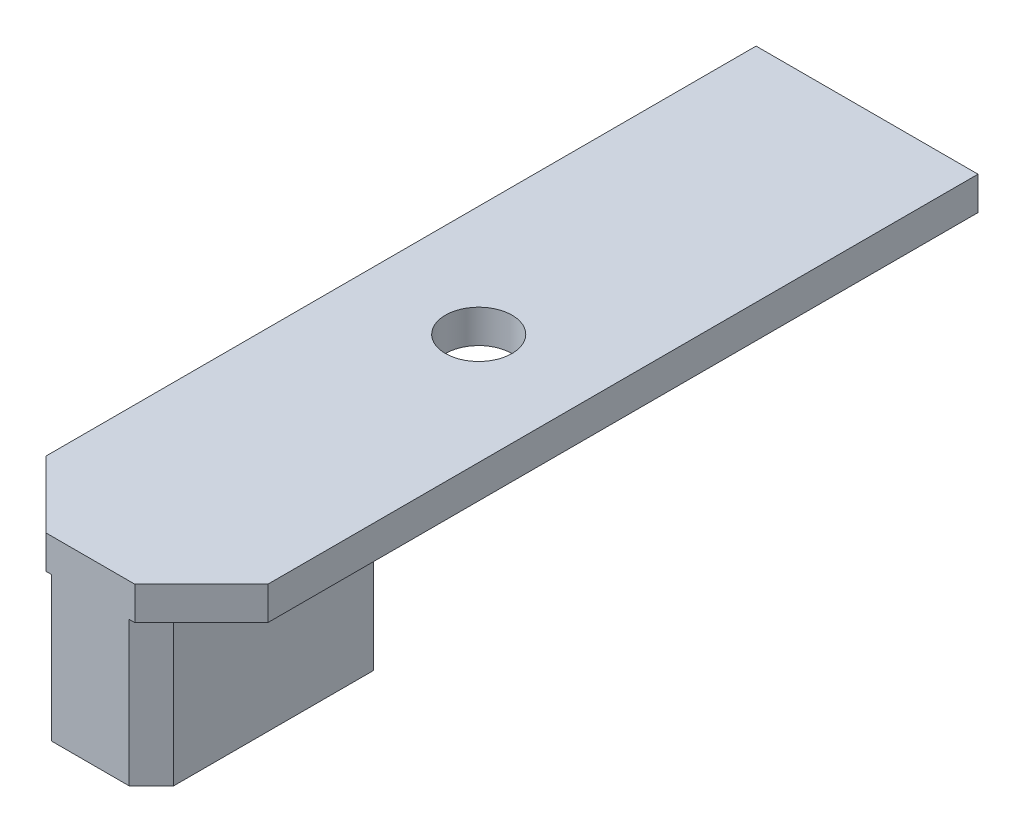
ISO-10303-21;
HEADER;
FILE_DESCRIPTION(('STEP AP214'),'2;1');
FILE_NAME('part.step','',(''),(''),'','','');
FILE_SCHEMA(('AUTOMOTIVE_DESIGN { 1 0 10303 214 1 1 1 1 }'));
ENDSEC;
DATA;
#1=APPLICATION_CONTEXT('core data for automotive mechanical design processes');
#2=APPLICATION_PROTOCOL_DEFINITION('international standard','automotive_design',2000,#1);
#3=PRODUCT_CONTEXT('',#1,'mechanical');
#4=PRODUCT('Part','Part','',(#3));
#5=PRODUCT_RELATED_PRODUCT_CATEGORY('part','',(#4));
#6=PRODUCT_DEFINITION_FORMATION('','',#4);
#7=PRODUCT_DEFINITION_CONTEXT('part definition',#1,'design');
#8=PRODUCT_DEFINITION('design','',#6,#7);
#9=PRODUCT_DEFINITION_SHAPE('','',#8);
#10=(LENGTH_UNIT() NAMED_UNIT(*) SI_UNIT(.MILLI.,.METRE.));
#11=(NAMED_UNIT(*) PLANE_ANGLE_UNIT() SI_UNIT($,.RADIAN.));
#12=(NAMED_UNIT(*) SI_UNIT($,.STERADIAN.) SOLID_ANGLE_UNIT());
#13=UNCERTAINTY_MEASURE_WITH_UNIT(LENGTH_MEASURE(1.E-05),#10,'distance_accuracy_value','');
#14=(GEOMETRIC_REPRESENTATION_CONTEXT(3) GLOBAL_UNCERTAINTY_ASSIGNED_CONTEXT((#13)) GLOBAL_UNIT_ASSIGNED_CONTEXT((#10,
#11,#12)) REPRESENTATION_CONTEXT('',''));
#15=CARTESIAN_POINT('',(0.,0.,0.));
#16=DIRECTION('',(0.,0.,1.));
#17=DIRECTION('',(1.,0.,0.));
#18=AXIS2_PLACEMENT_3D('',#15,#16,#17);
#19=CARTESIAN_POINT('',(0.,0.,0.));
#20=DIRECTION('',(0.,1.,0.));
#21=DIRECTION('',(0.,0.,1.));
#22=AXIS2_PLACEMENT_3D('',#19,#20,#21);
#23=PLANE('',#22);
#24=CARTESIAN_POINT('',(-5.,0.,-17.5));
#25=DIRECTION('',(0.,1.,0.));
#26=DIRECTION('',(0.,0.,1.));
#27=AXIS2_PLACEMENT_3D('',#24,#25,#26);
#28=CIRCLE('',#27,1.5);
#29=CARTESIAN_POINT('',(-5.,0.,-16.));
#30=VERTEX_POINT('',#29);
#31=EDGE_CURVE('E388',#30,#30,#28,.T.);
#32=ORIENTED_EDGE('',*,*,#31,.T.);
#33=EDGE_LOOP('',(#32));
#34=FACE_BOUND('',#33,.T.);
#35=DIRECTION('',(-0.707106781186548,0.,-0.707106781186548));
#36=VECTOR('',#35,1.);
#37=CARTESIAN_POINT('',(-6.75,0.,0.));
#38=LINE('',#37,#36);
#39=CARTESIAN_POINT('',(-6.75,0.,0.));
#40=VERTEX_POINT('',#39);
#41=CARTESIAN_POINT('',(-7.75,0.,-1.));
#42=VERTEX_POINT('',#41);
#43=EDGE_CURVE('E143',#40,#42,#38,.T.);
#44=ORIENTED_EDGE('',*,*,#43,.F.);
#45=DIRECTION('',(1.,0.,0.));
#46=VECTOR('',#45,1.);
#47=CARTESIAN_POINT('',(-3.,0.,0.));
#48=LINE('',#47,#46);
#49=CARTESIAN_POINT('',(-7.,0.,0.));
#50=VERTEX_POINT('',#49);
#51=EDGE_CURVE('E180',#50,#40,#48,.T.);
#52=ORIENTED_EDGE('',*,*,#51,.F.);
#53=DIRECTION('',(0.707106781186548,0.,0.707106781186547));
#54=VECTOR('',#53,1.);
#55=CARTESIAN_POINT('',(-7.,0.,0.));
#56=LINE('',#55,#54);
#57=CARTESIAN_POINT('',(-10.,0.,-3.));
#58=VERTEX_POINT('',#57);
#59=EDGE_CURVE('E149',#58,#50,#56,.T.);
#60=ORIENTED_EDGE('',*,*,#59,.F.);
#61=DIRECTION('',(0.,0.,1.));
#62=VECTOR('',#61,1.);
#63=CARTESIAN_POINT('',(-10.,0.,-3.));
#64=LINE('',#63,#62);
#65=CARTESIAN_POINT('',(-10.,0.,-35.));
#66=VERTEX_POINT('',#65);
#67=EDGE_CURVE('E146',#66,#58,#64,.T.);
#68=ORIENTED_EDGE('',*,*,#67,.F.);
#69=DIRECTION('',(-1.,0.,0.));
#70=VECTOR('',#69,1.);
#71=CARTESIAN_POINT('',(0.,0.,-35.));
#72=LINE('',#71,#70);
#73=CARTESIAN_POINT('',(0.,0.,-35.));
#74=VERTEX_POINT('',#73);
#75=EDGE_CURVE('E159',#74,#66,#72,.T.);
#76=ORIENTED_EDGE('',*,*,#75,.F.);
#77=DIRECTION('',(0.,0.,-1.));
#78=VECTOR('',#77,1.);
#79=CARTESIAN_POINT('',(0.,0.,-3.));
#80=LINE('',#79,#78);
#81=CARTESIAN_POINT('',(0.,0.,-3.));
#82=VERTEX_POINT('',#81);
#83=EDGE_CURVE('E196',#82,#74,#80,.T.);
#84=ORIENTED_EDGE('',*,*,#83,.F.);
#85=DIRECTION('',(0.707106781186547,0.,-0.707106781186548));
#86=VECTOR('',#85,1.);
#87=CARTESIAN_POINT('',(0.,0.,-3.));
#88=LINE('',#87,#86);
#89=CARTESIAN_POINT('',(-3.,0.,0.));
#90=VERTEX_POINT('',#89);
#91=EDGE_CURVE('E174',#90,#82,#88,.T.);
#92=ORIENTED_EDGE('',*,*,#91,.F.);
#93=CARTESIAN_POINT('',(-3.25,0.,0.));
#94=VERTEX_POINT('',#93);
#95=EDGE_CURVE('E171',#94,#90,#48,.T.);
#96=ORIENTED_EDGE('',*,*,#95,.F.);
#97=DIRECTION('',(-0.707106781186548,0.,0.707106781186548));
#98=VECTOR('',#97,1.);
#99=CARTESIAN_POINT('',(-2.25,0.,-0.999999999999999));
#100=LINE('',#99,#98);
#101=CARTESIAN_POINT('',(-2.25,0.,-0.999999999999999));
#102=VERTEX_POINT('',#101);
#103=EDGE_CURVE('E57',#102,#94,#100,.T.);
#104=ORIENTED_EDGE('',*,*,#103,.F.);
#105=DIRECTION('',(0.,0.,1.));
#106=VECTOR('',#105,1.);
#107=CARTESIAN_POINT('',(-2.25,0.,-0.999999999999999));
#108=LINE('',#107,#106);
#109=CARTESIAN_POINT('',(-2.25,0.,-10.));
#110=VERTEX_POINT('',#109);
#111=EDGE_CURVE('E232',#110,#102,#108,.T.);
#112=ORIENTED_EDGE('',*,*,#111,.F.);
#113=DIRECTION('',(1.,0.,0.));
#114=VECTOR('',#113,1.);
#115=CARTESIAN_POINT('',(-2.25,0.,-10.));
#116=LINE('',#115,#114);
#117=CARTESIAN_POINT('',(-7.75,0.,-10.));
#118=VERTEX_POINT('',#117);
#119=EDGE_CURVE('E234',#118,#110,#116,.T.);
#120=ORIENTED_EDGE('',*,*,#119,.F.);
#121=DIRECTION('',(0.,0.,-1.));
#122=VECTOR('',#121,1.);
#123=CARTESIAN_POINT('',(-7.75,0.,-1.));
#124=LINE('',#123,#122);
#125=EDGE_CURVE('E50',#42,#118,#124,.T.);
#126=ORIENTED_EDGE('',*,*,#125,.F.);
#127=EDGE_LOOP('',(#44,#52,#60,#68,#76,#84,#92,#96,#104,#112,#120,#126));
#128=FACE_BOUND('',#127,.T.);
#129=ADVANCED_FACE('F33',(#34,#128),#23,.F.);
#130=CARTESIAN_POINT('',(-10.,1.5,-3.));
#131=DIRECTION('',(1.,0.,0.));
#132=DIRECTION('',(0.,0.,-1.));
#133=AXIS2_PLACEMENT_3D('',#130,#131,#132);
#134=PLANE('',#133);
#135=ORIENTED_EDGE('',*,*,#67,.T.);
#136=DIRECTION('',(0.,-1.,0.));
#137=VECTOR('',#136,1.);
#138=CARTESIAN_POINT('',(-10.,1.5,-3.));
#139=LINE('',#138,#137);
#140=CARTESIAN_POINT('',(-10.,1.5,-3.));
#141=VERTEX_POINT('',#140);
#142=EDGE_CURVE('E11',#141,#58,#139,.T.);
#143=ORIENTED_EDGE('',*,*,#142,.F.);
#144=DIRECTION('',(0.,0.,1.));
#145=VECTOR('',#144,1.);
#146=CARTESIAN_POINT('',(-10.,1.5,-3.));
#147=LINE('',#146,#145);
#148=CARTESIAN_POINT('',(-10.,1.5,-35.));
#149=VERTEX_POINT('',#148);
#150=EDGE_CURVE('E155',#149,#141,#147,.T.);
#151=ORIENTED_EDGE('',*,*,#150,.F.);
#152=DIRECTION('',(0.,-1.,0.));
#153=VECTOR('',#152,1.);
#154=CARTESIAN_POINT('',(-10.,1.5,-35.));
#155=LINE('',#154,#153);
#156=EDGE_CURVE('E168',#149,#66,#155,.T.);
#157=ORIENTED_EDGE('',*,*,#156,.T.);
#158=EDGE_LOOP('',(#135,#143,#151,#157));
#159=FACE_BOUND('',#158,.T.);
#160=ADVANCED_FACE('F35',(#159),#134,.F.);
#161=CARTESIAN_POINT('',(-7.,1.5,0.));
#162=DIRECTION('',(0.707106781186547,0.,-0.707106781186548));
#163=DIRECTION('',(-0.707106781186548,0.,-0.707106781186547));
#164=AXIS2_PLACEMENT_3D('',#161,#162,#163);
#165=PLANE('',#164);
#166=ORIENTED_EDGE('',*,*,#59,.T.);
#167=DIRECTION('',(0.,-1.,0.));
#168=VECTOR('',#167,1.);
#169=CARTESIAN_POINT('',(-7.,1.5,0.));
#170=LINE('',#169,#168);
#171=CARTESIAN_POINT('',(-7.,1.5,0.));
#172=VERTEX_POINT('',#171);
#173=EDGE_CURVE('E42',#172,#50,#170,.T.);
#174=ORIENTED_EDGE('',*,*,#173,.F.);
#175=DIRECTION('',(0.707106781186548,0.,0.707106781186547));
#176=VECTOR('',#175,1.);
#177=CARTESIAN_POINT('',(-7.,1.5,0.));
#178=LINE('',#177,#176);
#179=EDGE_CURVE('E158',#141,#172,#178,.T.);
#180=ORIENTED_EDGE('',*,*,#179,.F.);
#181=ORIENTED_EDGE('',*,*,#142,.T.);
#182=EDGE_LOOP('',(#166,#174,#180,#181));
#183=FACE_BOUND('',#182,.T.);
#184=ADVANCED_FACE('F254',(#183),#165,.F.);
#185=CARTESIAN_POINT('',(-3.,1.5,0.));
#186=DIRECTION('',(0.,0.,-1.));
#187=DIRECTION('',(-1.,0.,0.));
#188=AXIS2_PLACEMENT_3D('',#185,#186,#187);
#189=PLANE('',#188);
#190=ORIENTED_EDGE('',*,*,#51,.T.);
#191=DIRECTION('',(0.,1.,0.));
#192=VECTOR('',#191,1.);
#193=CARTESIAN_POINT('',(-6.75,-6.5,0.));
#194=LINE('',#193,#192);
#195=CARTESIAN_POINT('',(-6.75,-6.5,0.));
#196=VERTEX_POINT('',#195);
#197=EDGE_CURVE('E244',#196,#40,#194,.T.);
#198=ORIENTED_EDGE('',*,*,#197,.F.);
#199=DIRECTION('',(-1.,0.,0.));
#200=VECTOR('',#199,1.);
#201=CARTESIAN_POINT('',(-3.25,-6.5,0.));
#202=LINE('',#201,#200);
#203=CARTESIAN_POINT('',(-3.25,-6.5,0.));
#204=VERTEX_POINT('',#203);
#205=EDGE_CURVE('E251',#204,#196,#202,.T.);
#206=ORIENTED_EDGE('',*,*,#205,.F.);
#207=DIRECTION('',(0.,1.,0.));
#208=VECTOR('',#207,1.);
#209=CARTESIAN_POINT('',(-3.25,-6.5,0.));
#210=LINE('',#209,#208);
#211=EDGE_CURVE('E226',#204,#94,#210,.T.);
#212=ORIENTED_EDGE('',*,*,#211,.T.);
#213=ORIENTED_EDGE('',*,*,#95,.T.);
#214=DIRECTION('',(0.,-1.,0.));
#215=VECTOR('',#214,1.);
#216=CARTESIAN_POINT('',(-3.,1.5,0.));
#217=LINE('',#216,#215);
#218=CARTESIAN_POINT('',(-3.,1.5,0.));
#219=VERTEX_POINT('',#218);
#220=EDGE_CURVE('E185',#219,#90,#217,.T.);
#221=ORIENTED_EDGE('',*,*,#220,.F.);
#222=DIRECTION('',(1.,0.,0.));
#223=VECTOR('',#222,1.);
#224=CARTESIAN_POINT('',(-3.,1.5,0.));
#225=LINE('',#224,#223);
#226=EDGE_CURVE('E161',#172,#219,#225,.T.);
#227=ORIENTED_EDGE('',*,*,#226,.F.);
#228=ORIENTED_EDGE('',*,*,#173,.T.);
#229=EDGE_LOOP('',(#190,#198,#206,#212,#213,#221,#227,#228));
#230=FACE_BOUND('',#229,.T.);
#231=ADVANCED_FACE('F222',(#230),#189,.F.);
#232=CARTESIAN_POINT('',(0.,1.5,-3.));
#233=DIRECTION('',(-0.707106781186548,0.,-0.707106781186547));
#234=DIRECTION('',(-0.707106781186547,0.,0.707106781186548));
#235=AXIS2_PLACEMENT_3D('',#232,#233,#234);
#236=PLANE('',#235);
#237=ORIENTED_EDGE('',*,*,#91,.T.);
#238=DIRECTION('',(0.,-1.,0.));
#239=VECTOR('',#238,1.);
#240=CARTESIAN_POINT('',(0.,1.5,-3.));
#241=LINE('',#240,#239);
#242=CARTESIAN_POINT('',(0.,1.5,-3.));
#243=VERTEX_POINT('',#242);
#244=EDGE_CURVE('E188',#243,#82,#241,.T.);
#245=ORIENTED_EDGE('',*,*,#244,.F.);
#246=DIRECTION('',(0.707106781186547,0.,-0.707106781186548));
#247=VECTOR('',#246,1.);
#248=CARTESIAN_POINT('',(0.,1.5,-3.));
#249=LINE('',#248,#247);
#250=EDGE_CURVE('E163',#219,#243,#249,.T.);
#251=ORIENTED_EDGE('',*,*,#250,.F.);
#252=ORIENTED_EDGE('',*,*,#220,.T.);
#253=EDGE_LOOP('',(#237,#245,#251,#252));
#254=FACE_BOUND('',#253,.T.);
#255=ADVANCED_FACE('F203',(#254),#236,.F.);
#256=CARTESIAN_POINT('',(0.,1.5,-3.));
#257=DIRECTION('',(-1.,0.,0.));
#258=DIRECTION('',(0.,0.,1.));
#259=AXIS2_PLACEMENT_3D('',#256,#257,#258);
#260=PLANE('',#259);
#261=ORIENTED_EDGE('',*,*,#83,.T.);
#262=DIRECTION('',(0.,-1.,0.));
#263=VECTOR('',#262,1.);
#264=CARTESIAN_POINT('',(0.,1.5,-35.));
#265=LINE('',#264,#263);
#266=CARTESIAN_POINT('',(0.,1.5,-35.));
#267=VERTEX_POINT('',#266);
#268=EDGE_CURVE('E191',#267,#74,#265,.T.);
#269=ORIENTED_EDGE('',*,*,#268,.F.);
#270=DIRECTION('',(0.,0.,-1.));
#271=VECTOR('',#270,1.);
#272=CARTESIAN_POINT('',(0.,1.5,-3.));
#273=LINE('',#272,#271);
#274=EDGE_CURVE('E165',#243,#267,#273,.T.);
#275=ORIENTED_EDGE('',*,*,#274,.F.);
#276=ORIENTED_EDGE('',*,*,#244,.T.);
#277=EDGE_LOOP('',(#261,#269,#275,#276));
#278=FACE_BOUND('',#277,.T.);
#279=ADVANCED_FACE('F207',(#278),#260,.F.);
#280=CARTESIAN_POINT('',(0.,1.5,-35.));
#281=DIRECTION('',(0.,0.,1.));
#282=DIRECTION('',(1.,0.,0.));
#283=AXIS2_PLACEMENT_3D('',#280,#281,#282);
#284=PLANE('',#283);
#285=ORIENTED_EDGE('',*,*,#75,.T.);
#286=ORIENTED_EDGE('',*,*,#156,.F.);
#287=DIRECTION('',(-1.,0.,0.));
#288=VECTOR('',#287,1.);
#289=CARTESIAN_POINT('',(0.,1.5,-35.));
#290=LINE('',#289,#288);
#291=EDGE_CURVE('E167',#267,#149,#290,.T.);
#292=ORIENTED_EDGE('',*,*,#291,.F.);
#293=ORIENTED_EDGE('',*,*,#268,.T.);
#294=EDGE_LOOP('',(#285,#286,#292,#293));
#295=FACE_BOUND('',#294,.T.);
#296=ADVANCED_FACE('F212',(#295),#284,.F.);
#297=CARTESIAN_POINT('',(0.,1.5,0.));
#298=DIRECTION('',(0.,1.,0.));
#299=DIRECTION('',(0.,0.,1.));
#300=AXIS2_PLACEMENT_3D('',#297,#298,#299);
#301=PLANE('',#300);
#302=CARTESIAN_POINT('',(-5.,1.5,-17.5));
#303=DIRECTION('',(0.,1.,0.));
#304=DIRECTION('',(0.,0.,1.));
#305=AXIS2_PLACEMENT_3D('',#302,#303,#304);
#306=CIRCLE('',#305,1.5);
#307=CARTESIAN_POINT('',(-5.,1.5,-16.));
#308=VERTEX_POINT('',#307);
#309=EDGE_CURVE('E386',#308,#308,#306,.T.);
#310=ORIENTED_EDGE('',*,*,#309,.F.);
#311=EDGE_LOOP('',(#310));
#312=FACE_BOUND('',#311,.T.);
#313=ORIENTED_EDGE('',*,*,#150,.T.);
#314=ORIENTED_EDGE('',*,*,#179,.T.);
#315=ORIENTED_EDGE('',*,*,#226,.T.);
#316=ORIENTED_EDGE('',*,*,#250,.T.);
#317=ORIENTED_EDGE('',*,*,#274,.T.);
#318=ORIENTED_EDGE('',*,*,#291,.T.);
#319=EDGE_LOOP('',(#313,#314,#315,#316,#317,#318));
#320=FACE_BOUND('',#319,.T.);
#321=ADVANCED_FACE('F218',(#312,#320),#301,.T.);
#322=CARTESIAN_POINT('',(-7.75,-6.5,-1.));
#323=DIRECTION('',(1.,0.,0.));
#324=DIRECTION('',(0.,0.,-1.));
#325=AXIS2_PLACEMENT_3D('',#322,#323,#324);
#326=PLANE('',#325);
#327=ORIENTED_EDGE('',*,*,#125,.T.);
#328=DIRECTION('',(0.,1.,0.));
#329=VECTOR('',#328,1.);
#330=CARTESIAN_POINT('',(-7.75,-6.5,-10.));
#331=LINE('',#330,#329);
#332=CARTESIAN_POINT('',(-7.75,-6.5,-10.));
#333=VERTEX_POINT('',#332);
#334=EDGE_CURVE('E128',#333,#118,#331,.T.);
#335=ORIENTED_EDGE('',*,*,#334,.F.);
#336=DIRECTION('',(0.,0.,-1.));
#337=VECTOR('',#336,1.);
#338=CARTESIAN_POINT('',(-7.75,-6.5,-1.));
#339=LINE('',#338,#337);
#340=CARTESIAN_POINT('',(-7.75,-6.5,-1.));
#341=VERTEX_POINT('',#340);
#342=EDGE_CURVE('E134',#341,#333,#339,.T.);
#343=ORIENTED_EDGE('',*,*,#342,.F.);
#344=DIRECTION('',(0.,1.,0.));
#345=VECTOR('',#344,1.);
#346=CARTESIAN_POINT('',(-7.75,-6.5,-1.));
#347=LINE('',#346,#345);
#348=EDGE_CURVE('E243',#341,#42,#347,.T.);
#349=ORIENTED_EDGE('',*,*,#348,.T.);
#350=EDGE_LOOP('',(#327,#335,#343,#349));
#351=FACE_BOUND('',#350,.T.);
#352=ADVANCED_FACE('F145',(#351),#326,.F.);
#353=CARTESIAN_POINT('',(-2.25,-6.5,-10.));
#354=DIRECTION('',(0.,0.,1.));
#355=DIRECTION('',(1.,0.,0.));
#356=AXIS2_PLACEMENT_3D('',#353,#354,#355);
#357=PLANE('',#356);
#358=ORIENTED_EDGE('',*,*,#119,.T.);
#359=DIRECTION('',(0.,1.,0.));
#360=VECTOR('',#359,1.);
#361=CARTESIAN_POINT('',(-2.25,-6.5,-10.));
#362=LINE('',#361,#360);
#363=CARTESIAN_POINT('',(-2.25,-6.5,-10.));
#364=VERTEX_POINT('',#363);
#365=EDGE_CURVE('E130',#364,#110,#362,.T.);
#366=ORIENTED_EDGE('',*,*,#365,.F.);
#367=DIRECTION('',(1.,0.,0.));
#368=VECTOR('',#367,1.);
#369=CARTESIAN_POINT('',(-2.25,-6.5,-10.));
#370=LINE('',#369,#368);
#371=EDGE_CURVE('E123',#333,#364,#370,.T.);
#372=ORIENTED_EDGE('',*,*,#371,.F.);
#373=ORIENTED_EDGE('',*,*,#334,.T.);
#374=EDGE_LOOP('',(#358,#366,#372,#373));
#375=FACE_BOUND('',#374,.T.);
#376=ADVANCED_FACE('F126',(#375),#357,.F.);
#377=CARTESIAN_POINT('',(-2.25,-6.5,-0.999999999999999));
#378=DIRECTION('',(-1.,0.,0.));
#379=DIRECTION('',(0.,0.,1.));
#380=AXIS2_PLACEMENT_3D('',#377,#378,#379);
#381=PLANE('',#380);
#382=ORIENTED_EDGE('',*,*,#111,.T.);
#383=DIRECTION('',(0.,1.,0.));
#384=VECTOR('',#383,1.);
#385=CARTESIAN_POINT('',(-2.25,-6.5,-0.999999999999999));
#386=LINE('',#385,#384);
#387=CARTESIAN_POINT('',(-2.25,-6.5,-0.999999999999999));
#388=VERTEX_POINT('',#387);
#389=EDGE_CURVE('E151',#388,#102,#386,.T.);
#390=ORIENTED_EDGE('',*,*,#389,.F.);
#391=DIRECTION('',(0.,0.,1.));
#392=VECTOR('',#391,1.);
#393=CARTESIAN_POINT('',(-2.25,-6.5,-0.999999999999999));
#394=LINE('',#393,#392);
#395=EDGE_CURVE('E133',#364,#388,#394,.T.);
#396=ORIENTED_EDGE('',*,*,#395,.F.);
#397=ORIENTED_EDGE('',*,*,#365,.T.);
#398=EDGE_LOOP('',(#382,#390,#396,#397));
#399=FACE_BOUND('',#398,.T.);
#400=ADVANCED_FACE('F309',(#399),#381,.F.);
#401=CARTESIAN_POINT('',(-2.25,-6.5,-0.999999999999999));
#402=DIRECTION('',(-0.707106781186548,0.,-0.707106781186548));
#403=DIRECTION('',(-0.707106781186548,0.,0.707106781186547));
#404=AXIS2_PLACEMENT_3D('',#401,#402,#403);
#405=PLANE('',#404);
#406=ORIENTED_EDGE('',*,*,#103,.T.);
#407=ORIENTED_EDGE('',*,*,#211,.F.);
#408=DIRECTION('',(-0.707106781186548,0.,0.707106781186548));
#409=VECTOR('',#408,1.);
#410=CARTESIAN_POINT('',(-2.25,-6.5,-0.999999999999999));
#411=LINE('',#410,#409);
#412=EDGE_CURVE('E394',#388,#204,#411,.T.);
#413=ORIENTED_EDGE('',*,*,#412,.F.);
#414=ORIENTED_EDGE('',*,*,#389,.T.);
#415=EDGE_LOOP('',(#406,#407,#413,#414));
#416=FACE_BOUND('',#415,.T.);
#417=ADVANCED_FACE('F229',(#416),#405,.F.);
#418=CARTESIAN_POINT('',(-6.75,-6.5,0.));
#419=DIRECTION('',(0.707106781186548,0.,-0.707106781186548));
#420=DIRECTION('',(-0.707106781186548,0.,-0.707106781186548));
#421=AXIS2_PLACEMENT_3D('',#418,#419,#420);
#422=PLANE('',#421);
#423=ORIENTED_EDGE('',*,*,#43,.T.);
#424=ORIENTED_EDGE('',*,*,#348,.F.);
#425=DIRECTION('',(-0.707106781186548,0.,-0.707106781186548));
#426=VECTOR('',#425,1.);
#427=CARTESIAN_POINT('',(-6.75,-6.5,0.));
#428=LINE('',#427,#426);
#429=EDGE_CURVE('E139',#196,#341,#428,.T.);
#430=ORIENTED_EDGE('',*,*,#429,.F.);
#431=ORIENTED_EDGE('',*,*,#197,.T.);
#432=EDGE_LOOP('',(#423,#424,#430,#431));
#433=FACE_BOUND('',#432,.T.);
#434=ADVANCED_FACE('F250',(#433),#422,.F.);
#435=CARTESIAN_POINT('',(0.,-6.5,0.));
#436=DIRECTION('',(0.,1.,0.));
#437=DIRECTION('',(0.,0.,1.));
#438=AXIS2_PLACEMENT_3D('',#435,#436,#437);
#439=PLANE('',#438);
#440=ORIENTED_EDGE('',*,*,#342,.T.);
#441=ORIENTED_EDGE('',*,*,#371,.T.);
#442=ORIENTED_EDGE('',*,*,#395,.T.);
#443=ORIENTED_EDGE('',*,*,#412,.T.);
#444=ORIENTED_EDGE('',*,*,#205,.T.);
#445=ORIENTED_EDGE('',*,*,#429,.T.);
#446=EDGE_LOOP('',(#440,#441,#442,#443,#444,#445));
#447=FACE_BOUND('',#446,.T.);
#448=ADVANCED_FACE('F137',(#447),#439,.F.);
#449=CARTESIAN_POINT('',(-5.,-5.,-17.5));
#450=DIRECTION('',(0.,1.,0.));
#451=DIRECTION('',(0.,0.,1.));
#452=AXIS2_PLACEMENT_3D('',#449,#450,#451);
#453=CYLINDRICAL_SURFACE('',#452,1.5);
#454=CARTESIAN_POINT('',(-5.,1.5,-16.));
#455=CARTESIAN_POINT('',(-5.,1.484375,-16.));
#456=CARTESIAN_POINT('',(-5.,1.46875,-16.));
#457=CARTESIAN_POINT('',(-5.,1.4375,-16.));
#458=CARTESIAN_POINT('',(-5.,1.421875,-16.));
#459=CARTESIAN_POINT('',(-5.,1.390625,-16.));
#460=CARTESIAN_POINT('',(-5.,1.375,-16.));
#461=CARTESIAN_POINT('',(-5.,1.34375,-16.));
#462=CARTESIAN_POINT('',(-5.,1.328125,-16.));
#463=CARTESIAN_POINT('',(-5.,1.296875,-16.));
#464=CARTESIAN_POINT('',(-5.,1.28125,-16.));
#465=CARTESIAN_POINT('',(-5.,1.25,-16.));
#466=CARTESIAN_POINT('',(-5.,1.234375,-16.));
#467=CARTESIAN_POINT('',(-5.,1.203125,-16.));
#468=CARTESIAN_POINT('',(-5.,1.1875,-16.));
#469=CARTESIAN_POINT('',(-5.,1.15625,-16.));
#470=CARTESIAN_POINT('',(-5.,1.140625,-16.));
#471=CARTESIAN_POINT('',(-5.,1.109375,-16.));
#472=CARTESIAN_POINT('',(-5.,1.09375,-16.));
#473=CARTESIAN_POINT('',(-5.,1.0625,-16.));
#474=CARTESIAN_POINT('',(-5.,1.046875,-16.));
#475=CARTESIAN_POINT('',(-5.,1.015625,-16.));
#476=CARTESIAN_POINT('',(-5.,1.,-16.));
#477=CARTESIAN_POINT('',(-5.,0.96875,-16.));
#478=CARTESIAN_POINT('',(-5.,0.953125,-16.));
#479=CARTESIAN_POINT('',(-5.,0.921875,-16.));
#480=CARTESIAN_POINT('',(-5.,0.90625,-16.));
#481=CARTESIAN_POINT('',(-5.,0.875,-16.));
#482=CARTESIAN_POINT('',(-5.,0.859375,-16.));
#483=CARTESIAN_POINT('',(-5.,0.828125,-16.));
#484=CARTESIAN_POINT('',(-5.,0.8125,-16.));
#485=CARTESIAN_POINT('',(-5.,0.78125,-16.));
#486=CARTESIAN_POINT('',(-5.,0.765625,-16.));
#487=CARTESIAN_POINT('',(-5.,0.734375,-16.));
#488=CARTESIAN_POINT('',(-5.,0.71875,-16.));
#489=CARTESIAN_POINT('',(-5.,0.6875,-16.));
#490=CARTESIAN_POINT('',(-5.,0.671875,-16.));
#491=CARTESIAN_POINT('',(-5.,0.640625,-16.));
#492=CARTESIAN_POINT('',(-5.,0.625,-16.));
#493=CARTESIAN_POINT('',(-5.,0.59375,-16.));
#494=CARTESIAN_POINT('',(-5.,0.578125,-16.));
#495=CARTESIAN_POINT('',(-5.,0.546875,-16.));
#496=CARTESIAN_POINT('',(-5.,0.53125,-16.));
#497=CARTESIAN_POINT('',(-5.,0.5,-16.));
#498=CARTESIAN_POINT('',(-5.,0.484375,-16.));
#499=CARTESIAN_POINT('',(-5.,0.453125,-16.));
#500=CARTESIAN_POINT('',(-5.,0.4375,-16.));
#501=CARTESIAN_POINT('',(-5.,0.40625,-16.));
#502=CARTESIAN_POINT('',(-5.,0.390625,-16.));
#503=CARTESIAN_POINT('',(-5.,0.359374999999999,-16.));
#504=CARTESIAN_POINT('',(-5.,0.343749999999999,-16.));
#505=CARTESIAN_POINT('',(-5.,0.312499999999999,-16.));
#506=CARTESIAN_POINT('',(-5.,0.296874999999999,-16.));
#507=CARTESIAN_POINT('',(-5.,0.265624999999999,-16.));
#508=CARTESIAN_POINT('',(-5.,0.249999999999999,-16.));
#509=CARTESIAN_POINT('',(-5.,0.218749999999999,-16.));
#510=CARTESIAN_POINT('',(-5.,0.203124999999999,-16.));
#511=CARTESIAN_POINT('',(-5.,0.171874999999999,-16.));
#512=CARTESIAN_POINT('',(-5.,0.156249999999999,-16.));
#513=CARTESIAN_POINT('',(-5.,0.124999999999999,-16.));
#514=CARTESIAN_POINT('',(-5.,0.109374999999999,-16.));
#515=CARTESIAN_POINT('',(-5.,0.0781249999999992,-16.));
#516=CARTESIAN_POINT('',(-5.,0.0624999999999992,-16.));
#517=CARTESIAN_POINT('',(-5.,0.0312499999999992,-16.));
#518=CARTESIAN_POINT('',(-5.,0.0156249999999992,-16.));
#519=CARTESIAN_POINT('',(-5.,0.,-16.));
#520=B_SPLINE_CURVE_WITH_KNOTS('',3,(#454,#455,#456,#457,#458,#459,#460,#461,#462,#463,#464,
#465,#466,#467,#468,#469,#470,#471,#472,#473,#474,#475,#476,#477,#478,#479,#480,#481,#482,#483,
#484,#485,#486,#487,#488,#489,#490,#491,#492,#493,#494,#495,#496,#497,#498,#499,#500,#501,#502,
#503,#504,#505,#506,#507,#508,#509,#510,#511,#512,#513,#514,#515,#516,#517,#518,#519),
.UNSPECIFIED.,.F.,.F.,(4,2,2,2,2,2,2,2,2,2,2,2,2,2,2,2,2,2,2,2,2,2,2,2,2,2,2,2,2,2,2,2,4),(0.,
0.046875,0.0937500000000001,0.140625,0.1875,0.234375,0.28125,0.328125,0.375,0.421875,0.46875,
0.515625,0.5625,0.609375000000001,0.656250000000001,0.703125000000001,0.750000000000001,
0.796875000000001,0.843750000000001,0.890625000000001,0.937500000000001,0.984375000000001,
1.03125,1.078125,1.125,1.171875,1.21875,1.265625,1.3125,1.359375,1.40625,1.453125,1.5),.UNSPECIFIED.);
#521=EDGE_CURVE('BSEAM334',#308,#30,#520,.T.);
#522=ORIENTED_EDGE('',*,*,#309,.T.);
#523=ORIENTED_EDGE('',*,*,#31,.F.);
#524=ORIENTED_EDGE('',*,*,#521,.T.);
#525=ORIENTED_EDGE('',*,*,#521,.F.);
#526=EDGE_LOOP('',(#522,#524,#523,#525));
#527=FACE_BOUND('',#526,.T.);
#528=ADVANCED_FACE('F334',(#527),#453,.F.);
#529=CLOSED_SHELL('',(#129,#160,#184,#231,#255,#279,#296,#321,#352,#376,#400,#417,#434,#448,#528));
#530=MANIFOLD_SOLID_BREP('B2',#529);
#531=ADVANCED_BREP_SHAPE_REPRESENTATION('',(#18,#530),#14);
#532=SHAPE_DEFINITION_REPRESENTATION(#9,#531);
ENDSEC;
END-ISO-10303-21;
